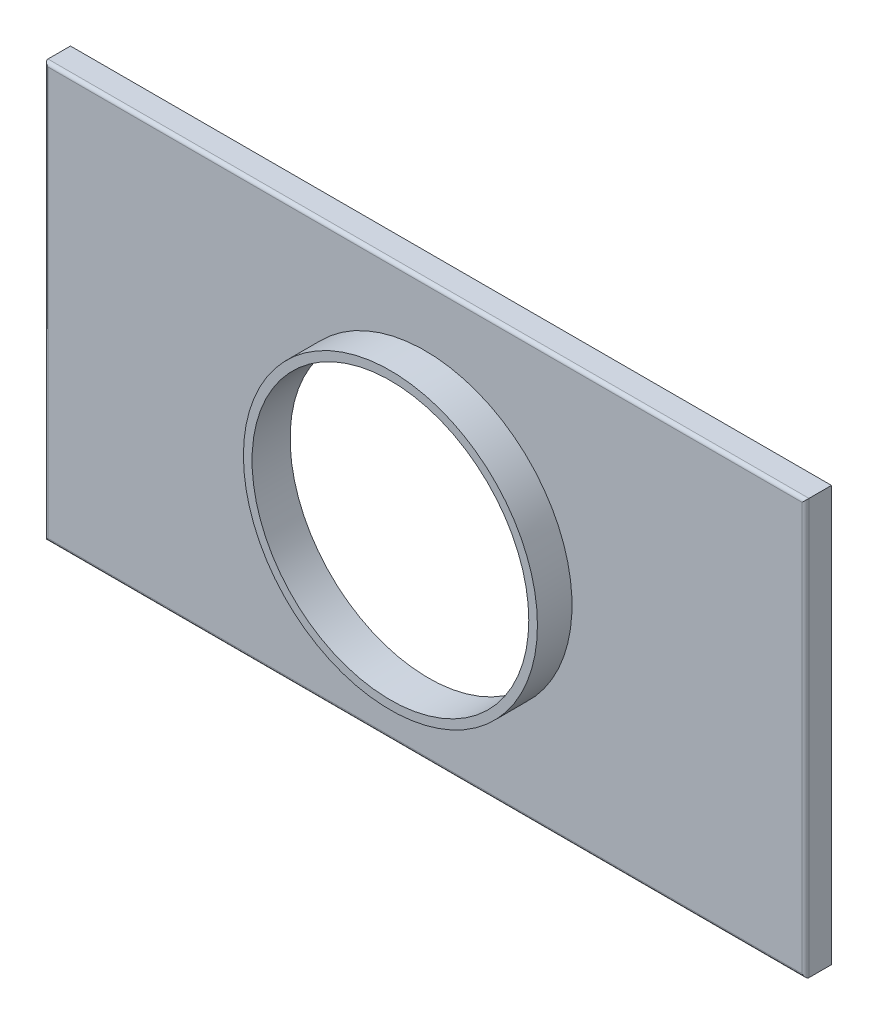
ISO-10303-21;
HEADER;
FILE_DESCRIPTION(('STEP AP214'),'2;1');
FILE_NAME('part.step','',(''),(''),'','','');
FILE_SCHEMA(('AUTOMOTIVE_DESIGN { 1 0 10303 214 1 1 1 1 }'));
ENDSEC;
DATA;
#1=APPLICATION_CONTEXT('core data for automotive mechanical design processes');
#2=APPLICATION_PROTOCOL_DEFINITION('international standard','automotive_design',2000,#1);
#3=PRODUCT_CONTEXT('',#1,'mechanical');
#4=PRODUCT('Part','Part','',(#3));
#5=PRODUCT_RELATED_PRODUCT_CATEGORY('part','',(#4));
#6=PRODUCT_DEFINITION_FORMATION('','',#4);
#7=PRODUCT_DEFINITION_CONTEXT('part definition',#1,'design');
#8=PRODUCT_DEFINITION('design','',#6,#7);
#9=PRODUCT_DEFINITION_SHAPE('','',#8);
#10=(LENGTH_UNIT() NAMED_UNIT(*) SI_UNIT(.MILLI.,.METRE.));
#11=(NAMED_UNIT(*) PLANE_ANGLE_UNIT() SI_UNIT($,.RADIAN.));
#12=(NAMED_UNIT(*) SI_UNIT($,.STERADIAN.) SOLID_ANGLE_UNIT());
#13=UNCERTAINTY_MEASURE_WITH_UNIT(LENGTH_MEASURE(1.E-05),#10,'distance_accuracy_value','');
#14=(GEOMETRIC_REPRESENTATION_CONTEXT(3) GLOBAL_UNCERTAINTY_ASSIGNED_CONTEXT((#13)) GLOBAL_UNIT_ASSIGNED_CONTEXT((#10,
#11,#12)) REPRESENTATION_CONTEXT('',''));
#15=CARTESIAN_POINT('',(0.,0.,0.));
#16=DIRECTION('',(0.,0.,1.));
#17=DIRECTION('',(1.,0.,0.));
#18=AXIS2_PLACEMENT_3D('',#15,#16,#17);
#19=CARTESIAN_POINT('',(0.,0.,2.54));
#20=DIRECTION('',(0.,0.,-1.));
#21=DIRECTION('',(-1.,0.,0.));
#22=AXIS2_PLACEMENT_3D('',#19,#20,#21);
#23=PLANE('',#22);
#24=DIRECTION('',(0.,-1.,0.));
#25=VECTOR('',#24,1.);
#26=CARTESIAN_POINT('',(-276.86,0.,2.54));
#27=LINE('',#26,#25);
#28=CARTESIAN_POINT('',(-276.86,149.86,2.54));
#29=VERTEX_POINT('',#28);
#30=CARTESIAN_POINT('',(-276.86,-149.86,2.54));
#31=VERTEX_POINT('',#30);
#32=EDGE_CURVE('E187',#29,#31,#27,.T.);
#33=ORIENTED_EDGE('',*,*,#32,.T.);
#34=DIRECTION('',(1.,0.,0.));
#35=VECTOR('',#34,1.);
#36=CARTESIAN_POINT('',(0.,-149.86,2.54));
#37=LINE('',#36,#35);
#38=CARTESIAN_POINT('',(276.86,-149.86,2.54));
#39=VERTEX_POINT('',#38);
#40=EDGE_CURVE('E189',#31,#39,#37,.T.);
#41=ORIENTED_EDGE('',*,*,#40,.T.);
#42=DIRECTION('',(0.,1.,0.));
#43=VECTOR('',#42,1.);
#44=CARTESIAN_POINT('',(276.86,0.,2.54));
#45=LINE('',#44,#43);
#46=CARTESIAN_POINT('',(276.86,149.86,2.54));
#47=VERTEX_POINT('',#46);
#48=EDGE_CURVE('E183',#39,#47,#45,.T.);
#49=ORIENTED_EDGE('',*,*,#48,.T.);
#50=DIRECTION('',(-1.,0.,0.));
#51=VECTOR('',#50,1.);
#52=CARTESIAN_POINT('',(0.,149.86,2.54));
#53=LINE('',#52,#51);
#54=EDGE_CURVE('E185',#47,#29,#53,.T.);
#55=ORIENTED_EDGE('',*,*,#54,.T.);
#56=EDGE_LOOP('',(#33,#41,#49,#55));
#57=FACE_BOUND('',#56,.T.);
#58=CARTESIAN_POINT('',(0.,0.,2.54));
#59=DIRECTION('',(0.,0.,-1.));
#60=DIRECTION('',(-1.,0.,0.));
#61=AXIS2_PLACEMENT_3D('',#58,#59,#60);
#62=CIRCLE('',#61,107.95);
#63=CARTESIAN_POINT('',(-107.95,0.,2.54));
#64=VERTEX_POINT('',#63);
#65=EDGE_CURVE('E11',#64,#64,#62,.F.);
#66=ORIENTED_EDGE('',*,*,#65,.F.);
#67=EDGE_LOOP('',(#66));
#68=FACE_BOUND('',#67,.T.);
#69=ADVANCED_FACE('F33',(#57,#68),#23,.F.);
#70=CARTESIAN_POINT('',(279.4,-152.4,2.54));
#71=DIRECTION('',(-1.,0.,0.));
#72=DIRECTION('',(0.,0.,1.));
#73=AXIS2_PLACEMENT_3D('',#70,#71,#72);
#74=PLANE('',#73);
#75=DIRECTION('',(0.,0.,-1.));
#76=VECTOR('',#75,1.);
#77=CARTESIAN_POINT('',(279.4,152.4,2.54));
#78=LINE('',#77,#76);
#79=CARTESIAN_POINT('',(279.4,152.4,0.));
#80=VERTEX_POINT('',#79);
#81=CARTESIAN_POINT('',(279.4,152.4,-16.51));
#82=VERTEX_POINT('',#81);
#83=EDGE_CURVE('E172',#80,#82,#78,.T.);
#84=ORIENTED_EDGE('',*,*,#83,.F.);
#85=DIRECTION('',(0.,1.,0.));
#86=VECTOR('',#85,1.);
#87=CARTESIAN_POINT('',(279.4,-152.4,0.));
#88=LINE('',#87,#86);
#89=CARTESIAN_POINT('',(279.4,-152.4,0.));
#90=VERTEX_POINT('',#89);
#91=EDGE_CURVE('E41',#80,#90,#88,.F.);
#92=ORIENTED_EDGE('',*,*,#91,.T.);
#93=DIRECTION('',(0.,0.,-1.));
#94=VECTOR('',#93,1.);
#95=CARTESIAN_POINT('',(279.4,-152.4,2.54));
#96=LINE('',#95,#94);
#97=CARTESIAN_POINT('',(279.4,-152.4,-16.51));
#98=VERTEX_POINT('',#97);
#99=EDGE_CURVE('E166',#90,#98,#96,.T.);
#100=ORIENTED_EDGE('',*,*,#99,.T.);
#101=DIRECTION('',(0.,1.,0.));
#102=VECTOR('',#101,1.);
#103=CARTESIAN_POINT('',(279.4,-152.4,-16.51));
#104=LINE('',#103,#102);
#105=EDGE_CURVE('E157',#98,#82,#104,.T.);
#106=ORIENTED_EDGE('',*,*,#105,.T.);
#107=EDGE_LOOP('',(#84,#92,#100,#106));
#108=FACE_BOUND('',#107,.T.);
#109=ADVANCED_FACE('F229',(#108),#74,.F.);
#110=CARTESIAN_POINT('',(-279.4,152.4,2.54));
#111=DIRECTION('',(0.,-1.,0.));
#112=DIRECTION('',(0.,0.,-1.));
#113=AXIS2_PLACEMENT_3D('',#110,#111,#112);
#114=PLANE('',#113);
#115=DIRECTION('',(0.,0.,-1.));
#116=VECTOR('',#115,1.);
#117=CARTESIAN_POINT('',(-279.4,152.4,2.54));
#118=LINE('',#117,#116);
#119=CARTESIAN_POINT('',(-279.4,152.4,0.));
#120=VERTEX_POINT('',#119);
#121=CARTESIAN_POINT('',(-279.4,152.4,-16.51));
#122=VERTEX_POINT('',#121);
#123=EDGE_CURVE('E170',#120,#122,#118,.T.);
#124=ORIENTED_EDGE('',*,*,#123,.F.);
#125=DIRECTION('',(-1.,0.,0.));
#126=VECTOR('',#125,1.);
#127=CARTESIAN_POINT('',(-279.4,152.4,0.));
#128=LINE('',#127,#126);
#129=EDGE_CURVE('E48',#120,#80,#128,.F.);
#130=ORIENTED_EDGE('',*,*,#129,.T.);
#131=ORIENTED_EDGE('',*,*,#83,.T.);
#132=DIRECTION('',(-1.,0.,0.));
#133=VECTOR('',#132,1.);
#134=CARTESIAN_POINT('',(279.4,152.4,-16.51));
#135=LINE('',#134,#133);
#136=EDGE_CURVE('E160',#82,#122,#135,.T.);
#137=ORIENTED_EDGE('',*,*,#136,.T.);
#138=EDGE_LOOP('',(#124,#130,#131,#137));
#139=FACE_BOUND('',#138,.T.);
#140=ADVANCED_FACE('F237',(#139),#114,.F.);
#141=CARTESIAN_POINT('',(-279.4,-152.4,2.54));
#142=DIRECTION('',(1.,0.,0.));
#143=DIRECTION('',(0.,0.,-1.));
#144=AXIS2_PLACEMENT_3D('',#141,#142,#143);
#145=PLANE('',#144);
#146=DIRECTION('',(0.,0.,-1.));
#147=VECTOR('',#146,1.);
#148=CARTESIAN_POINT('',(-279.4,-152.4,2.54));
#149=LINE('',#148,#147);
#150=CARTESIAN_POINT('',(-279.4,-152.4,0.));
#151=VERTEX_POINT('',#150);
#152=CARTESIAN_POINT('',(-279.4,-152.4,-16.51));
#153=VERTEX_POINT('',#152);
#154=EDGE_CURVE('E168',#151,#153,#149,.T.);
#155=ORIENTED_EDGE('',*,*,#154,.F.);
#156=DIRECTION('',(0.,-1.,0.));
#157=VECTOR('',#156,1.);
#158=CARTESIAN_POINT('',(-279.4,-152.4,0.));
#159=LINE('',#158,#157);
#160=EDGE_CURVE('E56',#151,#120,#159,.F.);
#161=ORIENTED_EDGE('',*,*,#160,.T.);
#162=ORIENTED_EDGE('',*,*,#123,.T.);
#163=DIRECTION('',(0.,-1.,0.));
#164=VECTOR('',#163,1.);
#165=CARTESIAN_POINT('',(-279.4,152.4,-16.51));
#166=LINE('',#165,#164);
#167=EDGE_CURVE('E163',#122,#153,#166,.T.);
#168=ORIENTED_EDGE('',*,*,#167,.T.);
#169=EDGE_LOOP('',(#155,#161,#162,#168));
#170=FACE_BOUND('',#169,.T.);
#171=ADVANCED_FACE('F250',(#170),#145,.F.);
#172=CARTESIAN_POINT('',(-279.4,-152.4,2.54));
#173=DIRECTION('',(0.,1.,0.));
#174=DIRECTION('',(0.,0.,1.));
#175=AXIS2_PLACEMENT_3D('',#172,#173,#174);
#176=PLANE('',#175);
#177=ORIENTED_EDGE('',*,*,#99,.F.);
#178=DIRECTION('',(1.,0.,0.));
#179=VECTOR('',#178,1.);
#180=CARTESIAN_POINT('',(-279.4,-152.4,0.));
#181=LINE('',#180,#179);
#182=EDGE_CURVE('E192',#90,#151,#181,.F.);
#183=ORIENTED_EDGE('',*,*,#182,.T.);
#184=ORIENTED_EDGE('',*,*,#154,.T.);
#185=DIRECTION('',(1.,0.,0.));
#186=VECTOR('',#185,1.);
#187=CARTESIAN_POINT('',(-279.4,-152.4,-16.51));
#188=LINE('',#187,#186);
#189=EDGE_CURVE('E150',#153,#98,#188,.T.);
#190=ORIENTED_EDGE('',*,*,#189,.T.);
#191=EDGE_LOOP('',(#177,#183,#184,#190));
#192=FACE_BOUND('',#191,.T.);
#193=ADVANCED_FACE('F247',(#192),#176,.F.);
#194=CARTESIAN_POINT('',(0.,0.,-16.51));
#195=DIRECTION('',(0.,0.,1.));
#196=DIRECTION('',(1.,0.,0.));
#197=AXIS2_PLACEMENT_3D('',#194,#195,#196);
#198=PLANE('',#197);
#199=DIRECTION('',(1.,0.,0.));
#200=VECTOR('',#199,1.);
#201=CARTESIAN_POINT('',(-276.86,-149.86,-16.51));
#202=LINE('',#201,#200);
#203=CARTESIAN_POINT('',(-276.86,-149.86,-16.51));
#204=VERTEX_POINT('',#203);
#205=CARTESIAN_POINT('',(276.86,-149.86,-16.51));
#206=VERTEX_POINT('',#205);
#207=EDGE_CURVE('E123',#204,#206,#202,.T.);
#208=ORIENTED_EDGE('',*,*,#207,.T.);
#209=DIRECTION('',(0.,1.,0.));
#210=VECTOR('',#209,1.);
#211=CARTESIAN_POINT('',(276.86,-149.86,-16.51));
#212=LINE('',#211,#210);
#213=CARTESIAN_POINT('',(276.86,149.86,-16.51));
#214=VERTEX_POINT('',#213);
#215=EDGE_CURVE('E116',#206,#214,#212,.T.);
#216=ORIENTED_EDGE('',*,*,#215,.T.);
#217=DIRECTION('',(-1.,0.,0.));
#218=VECTOR('',#217,1.);
#219=CARTESIAN_POINT('',(276.86,149.86,-16.51));
#220=LINE('',#219,#218);
#221=CARTESIAN_POINT('',(-276.86,149.86,-16.51));
#222=VERTEX_POINT('',#221);
#223=EDGE_CURVE('E127',#214,#222,#220,.T.);
#224=ORIENTED_EDGE('',*,*,#223,.T.);
#225=DIRECTION('',(0.,-1.,0.));
#226=VECTOR('',#225,1.);
#227=CARTESIAN_POINT('',(-276.86,149.86,-16.51));
#228=LINE('',#227,#226);
#229=EDGE_CURVE('E132',#222,#204,#228,.T.);
#230=ORIENTED_EDGE('',*,*,#229,.T.);
#231=EDGE_LOOP('',(#208,#216,#224,#230));
#232=FACE_BOUND('',#231,.T.);
#233=ORIENTED_EDGE('',*,*,#189,.F.);
#234=ORIENTED_EDGE('',*,*,#167,.F.);
#235=ORIENTED_EDGE('',*,*,#136,.F.);
#236=ORIENTED_EDGE('',*,*,#105,.F.);
#237=EDGE_LOOP('',(#233,#234,#235,#236));
#238=FACE_BOUND('',#237,.T.);
#239=ADVANCED_FACE('F134',(#232,#238),#198,.F.);
#240=CARTESIAN_POINT('',(276.86,-149.86,-16.51));
#241=DIRECTION('',(1.,0.,0.));
#242=DIRECTION('',(0.,0.,-1.));
#243=AXIS2_PLACEMENT_3D('',#240,#241,#242);
#244=PLANE('',#243);
#245=DIRECTION('',(0.,-1.,0.));
#246=VECTOR('',#245,1.);
#247=CARTESIAN_POINT('',(276.86,0.,0.));
#248=LINE('',#247,#246);
#249=CARTESIAN_POINT('',(276.86,149.86,0.));
#250=VERTEX_POINT('',#249);
#251=CARTESIAN_POINT('',(276.86,-149.86,0.));
#252=VERTEX_POINT('',#251);
#253=EDGE_CURVE('E119',#250,#252,#248,.T.);
#254=ORIENTED_EDGE('',*,*,#253,.F.);
#255=DIRECTION('',(0.,0.,1.));
#256=VECTOR('',#255,1.);
#257=CARTESIAN_POINT('',(276.86,149.86,-16.51));
#258=LINE('',#257,#256);
#259=EDGE_CURVE('E111',#214,#250,#258,.T.);
#260=ORIENTED_EDGE('',*,*,#259,.F.);
#261=ORIENTED_EDGE('',*,*,#215,.F.);
#262=DIRECTION('',(0.,0.,1.));
#263=VECTOR('',#262,1.);
#264=CARTESIAN_POINT('',(276.86,-149.86,-16.51));
#265=LINE('',#264,#263);
#266=EDGE_CURVE('E148',#206,#252,#265,.T.);
#267=ORIENTED_EDGE('',*,*,#266,.T.);
#268=EDGE_LOOP('',(#254,#260,#261,#267));
#269=FACE_BOUND('',#268,.T.);
#270=ADVANCED_FACE('F113',(#269),#244,.F.);
#271=CARTESIAN_POINT('',(-276.86,-149.86,-16.51));
#272=DIRECTION('',(0.,-1.,0.));
#273=DIRECTION('',(1.,0.,0.));
#274=AXIS2_PLACEMENT_3D('',#271,#272,#273);
#275=PLANE('',#274);
#276=DIRECTION('',(-1.,0.,0.));
#277=VECTOR('',#276,1.);
#278=CARTESIAN_POINT('',(0.,-149.86,0.));
#279=LINE('',#278,#277);
#280=CARTESIAN_POINT('',(-276.86,-149.86,0.));
#281=VERTEX_POINT('',#280);
#282=EDGE_CURVE('E179',#252,#281,#279,.T.);
#283=ORIENTED_EDGE('',*,*,#282,.F.);
#284=ORIENTED_EDGE('',*,*,#266,.F.);
#285=ORIENTED_EDGE('',*,*,#207,.F.);
#286=DIRECTION('',(0.,0.,1.));
#287=VECTOR('',#286,1.);
#288=CARTESIAN_POINT('',(-276.86,-149.86,-16.51));
#289=LINE('',#288,#287);
#290=EDGE_CURVE('E151',#204,#281,#289,.T.);
#291=ORIENTED_EDGE('',*,*,#290,.T.);
#292=EDGE_LOOP('',(#283,#284,#285,#291));
#293=FACE_BOUND('',#292,.T.);
#294=ADVANCED_FACE('F288',(#293),#275,.F.);
#295=CARTESIAN_POINT('',(-276.86,149.86,-16.51));
#296=DIRECTION('',(-1.,0.,0.));
#297=DIRECTION('',(0.,0.,1.));
#298=AXIS2_PLACEMENT_3D('',#295,#296,#297);
#299=PLANE('',#298);
#300=DIRECTION('',(0.,1.,0.));
#301=VECTOR('',#300,1.);
#302=CARTESIAN_POINT('',(-276.86,0.,0.));
#303=LINE('',#302,#301);
#304=CARTESIAN_POINT('',(-276.86,149.86,0.));
#305=VERTEX_POINT('',#304);
#306=EDGE_CURVE('E176',#281,#305,#303,.T.);
#307=ORIENTED_EDGE('',*,*,#306,.F.);
#308=ORIENTED_EDGE('',*,*,#290,.F.);
#309=ORIENTED_EDGE('',*,*,#229,.F.);
#310=DIRECTION('',(0.,0.,1.));
#311=VECTOR('',#310,1.);
#312=CARTESIAN_POINT('',(-276.86,149.86,-16.51));
#313=LINE('',#312,#311);
#314=EDGE_CURVE('E122',#222,#305,#313,.T.);
#315=ORIENTED_EDGE('',*,*,#314,.T.);
#316=EDGE_LOOP('',(#307,#308,#309,#315));
#317=FACE_BOUND('',#316,.T.);
#318=ADVANCED_FACE('F292',(#317),#299,.F.);
#319=CARTESIAN_POINT('',(276.86,149.86,-16.51));
#320=DIRECTION('',(0.,1.,0.));
#321=DIRECTION('',(-1.,0.,0.));
#322=AXIS2_PLACEMENT_3D('',#319,#320,#321);
#323=PLANE('',#322);
#324=DIRECTION('',(1.,0.,0.));
#325=VECTOR('',#324,1.);
#326=CARTESIAN_POINT('',(0.,149.86,0.));
#327=LINE('',#326,#325);
#328=EDGE_CURVE('E174',#305,#250,#327,.T.);
#329=ORIENTED_EDGE('',*,*,#328,.F.);
#330=ORIENTED_EDGE('',*,*,#314,.F.);
#331=ORIENTED_EDGE('',*,*,#223,.F.);
#332=ORIENTED_EDGE('',*,*,#259,.T.);
#333=EDGE_LOOP('',(#329,#330,#331,#332));
#334=FACE_BOUND('',#333,.T.);
#335=ADVANCED_FACE('F128',(#334),#323,.F.);
#336=CARTESIAN_POINT('',(0.,0.,0.));
#337=DIRECTION('',(0.,0.,-1.));
#338=DIRECTION('',(-1.,0.,0.));
#339=AXIS2_PLACEMENT_3D('',#336,#337,#338);
#340=PLANE('',#339);
#341=CARTESIAN_POINT('',(0.,0.,0.));
#342=DIRECTION('',(0.,0.,-1.));
#343=DIRECTION('',(-1.,0.,0.));
#344=AXIS2_PLACEMENT_3D('',#341,#342,#343);
#345=CIRCLE('',#344,101.6);
#346=CARTESIAN_POINT('',(101.6,0.,0.));
#347=VERTEX_POINT('',#346);
#348=EDGE_CURVE('E201',#347,#347,#345,.T.);
#349=ORIENTED_EDGE('',*,*,#348,.F.);
#350=EDGE_LOOP('',(#349));
#351=FACE_BOUND('',#350,.T.);
#352=ORIENTED_EDGE('',*,*,#328,.T.);
#353=ORIENTED_EDGE('',*,*,#253,.T.);
#354=ORIENTED_EDGE('',*,*,#282,.T.);
#355=ORIENTED_EDGE('',*,*,#306,.T.);
#356=EDGE_LOOP('',(#352,#353,#354,#355));
#357=FACE_BOUND('',#356,.T.);
#358=ADVANCED_FACE('F244',(#351,#357),#340,.T.);
#359=CARTESIAN_POINT('',(0.,149.86,0.));
#360=DIRECTION('',(-1.,0.,0.));
#361=DIRECTION('',(0.,0.,1.));
#362=AXIS2_PLACEMENT_3D('',#359,#360,#361);
#363=CYLINDRICAL_SURFACE('',#362,2.54);
#364=CARTESIAN_POINT('',(276.86,149.86,0.));
#365=DIRECTION('',(-0.707106781186547,0.707106781186547,0.));
#366=DIRECTION('',(0.707106781186547,0.707106781186547,0.));
#367=AXIS2_PLACEMENT_3D('',#364,#365,#366);
#368=ELLIPSE('',#367,3.59210244842766,2.54);
#369=EDGE_CURVE('E140',#80,#47,#368,.F.);
#370=ORIENTED_EDGE('',*,*,#369,.F.);
#371=ORIENTED_EDGE('',*,*,#129,.F.);
#372=CARTESIAN_POINT('',(-276.86,149.86,0.));
#373=DIRECTION('',(-0.707106781186547,-0.707106781186547,0.));
#374=DIRECTION('',(-0.707106781186547,0.707106781186547,0.));
#375=AXIS2_PLACEMENT_3D('',#372,#373,#374);
#376=ELLIPSE('',#375,3.59210244842766,2.54);
#377=EDGE_CURVE('E137',#29,#120,#376,.T.);
#378=ORIENTED_EDGE('',*,*,#377,.F.);
#379=ORIENTED_EDGE('',*,*,#54,.F.);
#380=EDGE_LOOP('',(#370,#371,#378,#379));
#381=FACE_BOUND('',#380,.T.);
#382=ADVANCED_FACE('F35',(#381),#363,.T.);
#383=CARTESIAN_POINT('',(-276.86,0.,0.));
#384=DIRECTION('',(0.,-1.,0.));
#385=DIRECTION('',(0.,0.,-1.));
#386=AXIS2_PLACEMENT_3D('',#383,#384,#385);
#387=CYLINDRICAL_SURFACE('',#386,2.54);
#388=ORIENTED_EDGE('',*,*,#377,.T.);
#389=ORIENTED_EDGE('',*,*,#160,.F.);
#390=CARTESIAN_POINT('',(-276.86,-149.86,0.));
#391=DIRECTION('',(0.707106781186547,-0.707106781186547,0.));
#392=DIRECTION('',(-0.707106781186547,-0.707106781186547,0.));
#393=AXIS2_PLACEMENT_3D('',#390,#391,#392);
#394=ELLIPSE('',#393,3.59210244842766,2.54);
#395=EDGE_CURVE('E200',#31,#151,#394,.T.);
#396=ORIENTED_EDGE('',*,*,#395,.F.);
#397=ORIENTED_EDGE('',*,*,#32,.F.);
#398=EDGE_LOOP('',(#388,#389,#396,#397));
#399=FACE_BOUND('',#398,.T.);
#400=ADVANCED_FACE('F261',(#399),#387,.T.);
#401=CARTESIAN_POINT('',(276.86,0.,0.));
#402=DIRECTION('',(0.,1.,0.));
#403=DIRECTION('',(0.,0.,1.));
#404=AXIS2_PLACEMENT_3D('',#401,#402,#403);
#405=CYLINDRICAL_SURFACE('',#404,2.54);
#406=ORIENTED_EDGE('',*,*,#369,.T.);
#407=ORIENTED_EDGE('',*,*,#48,.F.);
#408=CARTESIAN_POINT('',(276.86,-149.86,0.));
#409=DIRECTION('',(0.707106781186547,0.707106781186547,0.));
#410=DIRECTION('',(-0.707106781186547,0.707106781186547,0.));
#411=AXIS2_PLACEMENT_3D('',#408,#409,#410);
#412=ELLIPSE('',#411,3.59210244842766,2.54);
#413=EDGE_CURVE('E198',#90,#39,#412,.F.);
#414=ORIENTED_EDGE('',*,*,#413,.F.);
#415=ORIENTED_EDGE('',*,*,#91,.F.);
#416=EDGE_LOOP('',(#406,#407,#414,#415));
#417=FACE_BOUND('',#416,.T.);
#418=ADVANCED_FACE('F258',(#417),#405,.T.);
#419=CARTESIAN_POINT('',(0.,-149.86,0.));
#420=DIRECTION('',(1.,0.,0.));
#421=DIRECTION('',(0.,0.,-1.));
#422=AXIS2_PLACEMENT_3D('',#419,#420,#421);
#423=CYLINDRICAL_SURFACE('',#422,2.54);
#424=ORIENTED_EDGE('',*,*,#395,.T.);
#425=ORIENTED_EDGE('',*,*,#182,.F.);
#426=ORIENTED_EDGE('',*,*,#413,.T.);
#427=ORIENTED_EDGE('',*,*,#40,.F.);
#428=EDGE_LOOP('',(#424,#425,#426,#427));
#429=FACE_BOUND('',#428,.T.);
#430=ADVANCED_FACE('F226',(#429),#423,.T.);
#431=CARTESIAN_POINT('',(0.,0.,-16.51));
#432=DIRECTION('',(0.,0.,1.));
#433=DIRECTION('',(1.,0.,0.));
#434=AXIS2_PLACEMENT_3D('',#431,#432,#433);
#435=CYLINDRICAL_SURFACE('',#434,101.6);
#436=CARTESIAN_POINT('',(0.,0.,27.94));
#437=DIRECTION('',(0.,0.,1.));
#438=DIRECTION('',(1.,0.,0.));
#439=AXIS2_PLACEMENT_3D('',#436,#437,#438);
#440=CIRCLE('',#439,101.6);
#441=CARTESIAN_POINT('',(101.6,0.,27.94));
#442=VERTEX_POINT('',#441);
#443=EDGE_CURVE('E208',#442,#442,#440,.T.);
#444=CARTESIAN_POINT('',(101.6,0.,0.));
#445=CARTESIAN_POINT('',(101.6,0.,0.291041666666666));
#446=CARTESIAN_POINT('',(101.6,0.,0.582083333333333));
#447=CARTESIAN_POINT('',(101.6,0.,1.16416666666667));
#448=CARTESIAN_POINT('',(101.6,0.,1.45520833333333));
#449=CARTESIAN_POINT('',(101.6,0.,2.03729166666667));
#450=CARTESIAN_POINT('',(101.6,0.,2.32833333333333));
#451=CARTESIAN_POINT('',(101.6,0.,2.91041666666667));
#452=CARTESIAN_POINT('',(101.6,0.,3.20145833333333));
#453=CARTESIAN_POINT('',(101.6,0.,3.78354166666667));
#454=CARTESIAN_POINT('',(101.6,0.,4.07458333333333));
#455=CARTESIAN_POINT('',(101.6,0.,4.65666666666667));
#456=CARTESIAN_POINT('',(101.6,0.,4.94770833333333));
#457=CARTESIAN_POINT('',(101.6,0.,5.52979166666667));
#458=CARTESIAN_POINT('',(101.6,0.,5.82083333333333));
#459=CARTESIAN_POINT('',(101.6,0.,6.40291666666667));
#460=CARTESIAN_POINT('',(101.6,0.,6.69395833333333));
#461=CARTESIAN_POINT('',(101.6,0.,7.27604166666667));
#462=CARTESIAN_POINT('',(101.6,0.,7.56708333333333));
#463=CARTESIAN_POINT('',(101.6,0.,8.14916666666667));
#464=CARTESIAN_POINT('',(101.6,0.,8.44020833333333));
#465=CARTESIAN_POINT('',(101.6,0.,9.02229166666667));
#466=CARTESIAN_POINT('',(101.6,0.,9.31333333333333));
#467=CARTESIAN_POINT('',(101.6,0.,9.89541666666667));
#468=CARTESIAN_POINT('',(101.6,0.,10.1864583333333));
#469=CARTESIAN_POINT('',(101.6,0.,10.7685416666667));
#470=CARTESIAN_POINT('',(101.6,0.,11.0595833333333));
#471=CARTESIAN_POINT('',(101.6,0.,11.6416666666667));
#472=CARTESIAN_POINT('',(101.6,0.,11.9327083333333));
#473=CARTESIAN_POINT('',(101.6,0.,12.5147916666667));
#474=CARTESIAN_POINT('',(101.6,0.,12.8058333333333));
#475=CARTESIAN_POINT('',(101.6,0.,13.3879166666667));
#476=CARTESIAN_POINT('',(101.6,0.,13.6789583333333));
#477=CARTESIAN_POINT('',(101.6,0.,14.2610416666667));
#478=CARTESIAN_POINT('',(101.6,0.,14.5520833333333));
#479=CARTESIAN_POINT('',(101.6,0.,15.1341666666667));
#480=CARTESIAN_POINT('',(101.6,0.,15.4252083333333));
#481=CARTESIAN_POINT('',(101.6,0.,16.0072916666667));
#482=CARTESIAN_POINT('',(101.6,0.,16.2983333333333));
#483=CARTESIAN_POINT('',(101.6,0.,16.8804166666667));
#484=CARTESIAN_POINT('',(101.6,0.,17.1714583333333));
#485=CARTESIAN_POINT('',(101.6,0.,17.7535416666667));
#486=CARTESIAN_POINT('',(101.6,0.,18.0445833333333));
#487=CARTESIAN_POINT('',(101.6,0.,18.6266666666667));
#488=CARTESIAN_POINT('',(101.6,0.,18.9177083333333));
#489=CARTESIAN_POINT('',(101.6,0.,19.4997916666667));
#490=CARTESIAN_POINT('',(101.6,0.,19.7908333333333));
#491=CARTESIAN_POINT('',(101.6,0.,20.3729166666667));
#492=CARTESIAN_POINT('',(101.6,0.,20.6639583333333));
#493=CARTESIAN_POINT('',(101.6,0.,21.2460416666667));
#494=CARTESIAN_POINT('',(101.6,0.,21.5370833333333));
#495=CARTESIAN_POINT('',(101.6,0.,22.1191666666667));
#496=CARTESIAN_POINT('',(101.6,0.,22.4102083333333));
#497=CARTESIAN_POINT('',(101.6,0.,22.9922916666667));
#498=CARTESIAN_POINT('',(101.6,0.,23.2833333333333));
#499=CARTESIAN_POINT('',(101.6,0.,23.8654166666667));
#500=CARTESIAN_POINT('',(101.6,0.,24.1564583333333));
#501=CARTESIAN_POINT('',(101.6,0.,24.7385416666667));
#502=CARTESIAN_POINT('',(101.6,0.,25.0295833333333));
#503=CARTESIAN_POINT('',(101.6,0.,25.6116666666667));
#504=CARTESIAN_POINT('',(101.6,0.,25.9027083333333));
#505=CARTESIAN_POINT('',(101.6,0.,26.4847916666667));
#506=CARTESIAN_POINT('',(101.6,0.,26.7758333333333));
#507=CARTESIAN_POINT('',(101.6,0.,27.3579166666667));
#508=CARTESIAN_POINT('',(101.6,0.,27.6489583333333));
#509=CARTESIAN_POINT('',(101.6,0.,27.94));
#510=B_SPLINE_CURVE_WITH_KNOTS('',3,(#444,#445,#446,#447,#448,#449,#450,#451,#452,#453,#454,
#455,#456,#457,#458,#459,#460,#461,#462,#463,#464,#465,#466,#467,#468,#469,#470,#471,#472,#473,
#474,#475,#476,#477,#478,#479,#480,#481,#482,#483,#484,#485,#486,#487,#488,#489,#490,#491,#492,
#493,#494,#495,#496,#497,#498,#499,#500,#501,#502,#503,#504,#505,#506,#507,#508,#509),
.UNSPECIFIED.,.F.,.F.,(4,2,2,2,2,2,2,2,2,2,2,2,2,2,2,2,2,2,2,2,2,2,2,2,2,2,2,2,2,2,2,2,4),(0.,
0.873124999999999,1.74625,2.619375,3.4925,4.365625,5.23875,6.111875,6.985,7.858125,8.73125,
9.604375,10.4775,11.350625,12.22375,13.096875,13.97,14.843125,15.71625,16.589375,17.4625,
18.335625,19.20875,20.081875,20.955,21.828125,22.70125,23.574375,24.4475,25.320625,26.19375,
27.066875,27.94),.UNSPECIFIED.);
#511=EDGE_CURVE('BSEAM214',#347,#442,#510,.T.);
#512=ORIENTED_EDGE('',*,*,#348,.T.);
#513=ORIENTED_EDGE('',*,*,#443,.T.);
#514=ORIENTED_EDGE('',*,*,#511,.T.);
#515=ORIENTED_EDGE('',*,*,#511,.F.);
#516=EDGE_LOOP('',(#512,#514,#513,#515));
#517=FACE_BOUND('',#516,.T.);
#518=ADVANCED_FACE('F214',(#517),#435,.F.);
#519=CARTESIAN_POINT('',(0.,0.,27.94));
#520=DIRECTION('',(0.,0.,1.));
#521=DIRECTION('',(1.,0.,0.));
#522=AXIS2_PLACEMENT_3D('',#519,#520,#521);
#523=PLANE('',#522);
#524=CARTESIAN_POINT('',(0.,0.,27.94));
#525=DIRECTION('',(0.,0.,1.));
#526=DIRECTION('',(1.,0.,0.));
#527=AXIS2_PLACEMENT_3D('',#524,#525,#526);
#528=CIRCLE('',#527,107.95);
#529=CARTESIAN_POINT('',(107.95,0.,27.94));
#530=VERTEX_POINT('',#529);
#531=EDGE_CURVE('E143',#530,#530,#528,.T.);
#532=ORIENTED_EDGE('',*,*,#531,.T.);
#533=EDGE_LOOP('',(#532));
#534=FACE_BOUND('',#533,.T.);
#535=ORIENTED_EDGE('',*,*,#443,.F.);
#536=EDGE_LOOP('',(#535));
#537=FACE_BOUND('',#536,.T.);
#538=ADVANCED_FACE('F216',(#534,#537),#523,.T.);
#539=CARTESIAN_POINT('',(0.,0.,27.94));
#540=DIRECTION('',(0.,0.,-1.));
#541=DIRECTION('',(-1.,0.,0.));
#542=AXIS2_PLACEMENT_3D('',#539,#540,#541);
#543=CYLINDRICAL_SURFACE('',#542,107.95);
#544=ORIENTED_EDGE('',*,*,#531,.F.);
#545=EDGE_LOOP('',(#544));
#546=FACE_BOUND('',#545,.T.);
#547=ORIENTED_EDGE('',*,*,#65,.T.);
#548=EDGE_LOOP('',(#547));
#549=FACE_BOUND('',#548,.T.);
#550=ADVANCED_FACE('F218',(#546,#549),#543,.T.);
#551=CLOSED_SHELL('',(#69,#109,#140,#171,#193,#239,#270,#294,#318,#335,#358,#382,#400,#418,#430,
#518,#538,#550));
#552=MANIFOLD_SOLID_BREP('B2',#551);
#553=ADVANCED_BREP_SHAPE_REPRESENTATION('',(#18,#552),#14);
#554=SHAPE_DEFINITION_REPRESENTATION(#9,#553);
ENDSEC;
END-ISO-10303-21;
